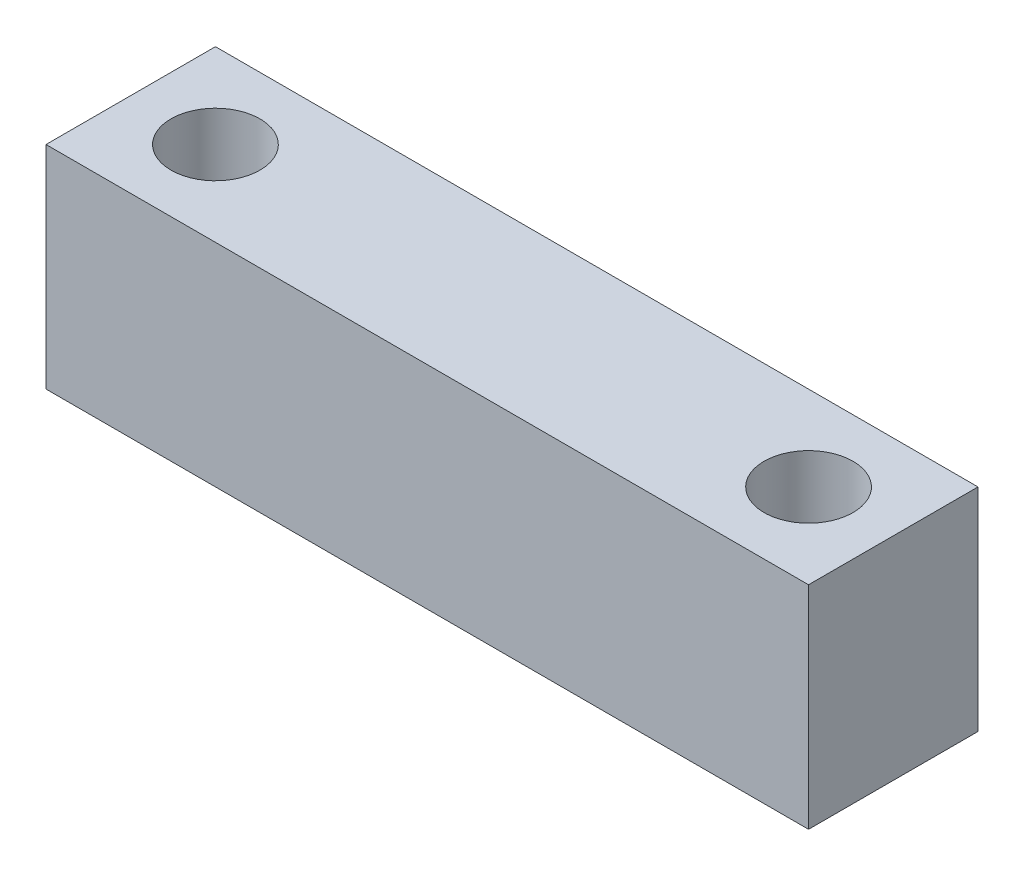
ISO-10303-21;
HEADER;
FILE_DESCRIPTION(('STEP AP214'),'2;1');
FILE_NAME('part.step','',(''),(''),'','','');
FILE_SCHEMA(('AUTOMOTIVE_DESIGN { 1 0 10303 214 1 1 1 1 }'));
ENDSEC;
DATA;
#1=APPLICATION_CONTEXT('core data for automotive mechanical design processes');
#2=APPLICATION_PROTOCOL_DEFINITION('international standard','automotive_design',2000,#1);
#3=PRODUCT_CONTEXT('',#1,'mechanical');
#4=PRODUCT('Part','Part','',(#3));
#5=PRODUCT_RELATED_PRODUCT_CATEGORY('part','',(#4));
#6=PRODUCT_DEFINITION_FORMATION('','',#4);
#7=PRODUCT_DEFINITION_CONTEXT('part definition',#1,'design');
#8=PRODUCT_DEFINITION('design','',#6,#7);
#9=PRODUCT_DEFINITION_SHAPE('','',#8);
#10=(LENGTH_UNIT() NAMED_UNIT(*) SI_UNIT(.MILLI.,.METRE.));
#11=(NAMED_UNIT(*) PLANE_ANGLE_UNIT() SI_UNIT($,.RADIAN.));
#12=(NAMED_UNIT(*) SI_UNIT($,.STERADIAN.) SOLID_ANGLE_UNIT());
#13=UNCERTAINTY_MEASURE_WITH_UNIT(LENGTH_MEASURE(1.E-05),#10,'distance_accuracy_value','');
#14=(GEOMETRIC_REPRESENTATION_CONTEXT(3) GLOBAL_UNCERTAINTY_ASSIGNED_CONTEXT((#13)) GLOBAL_UNIT_ASSIGNED_CONTEXT((#10,
#11,#12)) REPRESENTATION_CONTEXT('',''));
#15=CARTESIAN_POINT('',(0.,0.,0.));
#16=DIRECTION('',(0.,0.,1.));
#17=DIRECTION('',(1.,0.,0.));
#18=AXIS2_PLACEMENT_3D('',#15,#16,#17);
#19=CARTESIAN_POINT('',(0.,10.,0.));
#20=DIRECTION('',(0.,1.,0.));
#21=DIRECTION('',(0.,0.,1.));
#22=AXIS2_PLACEMENT_3D('',#19,#20,#21);
#23=PLANE('',#22);
#24=CARTESIAN_POINT('',(32.,10.,4.));
#25=DIRECTION('',(0.,1.,0.));
#26=DIRECTION('',(0.,0.,-1.));
#27=AXIS2_PLACEMENT_3D('',#24,#25,#26);
#28=CIRCLE('',#27,2.1);
#29=CARTESIAN_POINT('',(32.,10.,1.9));
#30=VERTEX_POINT('',#29);
#31=EDGE_CURVE('E112',#30,#30,#28,.T.);
#32=ORIENTED_EDGE('',*,*,#31,.F.);
#33=EDGE_LOOP('',(#32));
#34=FACE_BOUND('',#33,.T.);
#35=DIRECTION('',(0.,0.,1.));
#36=VECTOR('',#35,1.);
#37=CARTESIAN_POINT('',(0.,10.,0.));
#38=LINE('',#37,#36);
#39=CARTESIAN_POINT('',(0.,10.,0.));
#40=VERTEX_POINT('',#39);
#41=CARTESIAN_POINT('',(0.,10.,8.));
#42=VERTEX_POINT('',#41);
#43=EDGE_CURVE('E92',#40,#42,#38,.T.);
#44=ORIENTED_EDGE('',*,*,#43,.T.);
#45=DIRECTION('',(1.,0.,0.));
#46=VECTOR('',#45,1.);
#47=CARTESIAN_POINT('',(0.,10.,8.));
#48=LINE('',#47,#46);
#49=CARTESIAN_POINT('',(36.,10.,7.99999999999999));
#50=VERTEX_POINT('',#49);
#51=EDGE_CURVE('E87',#42,#50,#48,.T.);
#52=ORIENTED_EDGE('',*,*,#51,.T.);
#53=DIRECTION('',(0.,0.,-1.));
#54=VECTOR('',#53,1.);
#55=CARTESIAN_POINT('',(36.,10.,0.));
#56=LINE('',#55,#54);
#57=CARTESIAN_POINT('',(36.,10.,0.));
#58=VERTEX_POINT('',#57);
#59=EDGE_CURVE('E90',#50,#58,#56,.T.);
#60=ORIENTED_EDGE('',*,*,#59,.T.);
#61=DIRECTION('',(-1.,0.,0.));
#62=VECTOR('',#61,1.);
#63=CARTESIAN_POINT('',(0.,10.,0.));
#64=LINE('',#63,#62);
#65=EDGE_CURVE('E57',#58,#40,#64,.T.);
#66=ORIENTED_EDGE('',*,*,#65,.T.);
#67=EDGE_LOOP('',(#44,#52,#60,#66));
#68=FACE_BOUND('',#67,.T.);
#69=CARTESIAN_POINT('',(4.,10.,4.));
#70=DIRECTION('',(0.,1.,0.));
#71=DIRECTION('',(0.,0.,1.));
#72=AXIS2_PLACEMENT_3D('',#69,#70,#71);
#73=CIRCLE('',#72,2.1);
#74=CARTESIAN_POINT('',(4.,10.,6.1));
#75=VERTEX_POINT('',#74);
#76=EDGE_CURVE('E134',#75,#75,#73,.T.);
#77=ORIENTED_EDGE('',*,*,#76,.F.);
#78=EDGE_LOOP('',(#77));
#79=FACE_BOUND('',#78,.T.);
#80=ADVANCED_FACE('F39',(#34,#68,#79),#23,.T.);
#81=CARTESIAN_POINT('',(0.,0.,0.));
#82=DIRECTION('',(0.,1.,0.));
#83=DIRECTION('',(0.,0.,1.));
#84=AXIS2_PLACEMENT_3D('',#81,#82,#83);
#85=PLANE('',#84);
#86=DIRECTION('',(0.,0.,1.));
#87=VECTOR('',#86,1.);
#88=CARTESIAN_POINT('',(0.,0.,0.));
#89=LINE('',#88,#87);
#90=CARTESIAN_POINT('',(0.,0.,0.));
#91=VERTEX_POINT('',#90);
#92=CARTESIAN_POINT('',(0.,0.,8.));
#93=VERTEX_POINT('',#92);
#94=EDGE_CURVE('E108',#91,#93,#89,.T.);
#95=ORIENTED_EDGE('',*,*,#94,.F.);
#96=DIRECTION('',(-1.,0.,0.));
#97=VECTOR('',#96,1.);
#98=CARTESIAN_POINT('',(0.,0.,0.));
#99=LINE('',#98,#97);
#100=CARTESIAN_POINT('',(36.,0.,0.));
#101=VERTEX_POINT('',#100);
#102=EDGE_CURVE('E80',#101,#91,#99,.T.);
#103=ORIENTED_EDGE('',*,*,#102,.F.);
#104=DIRECTION('',(0.,0.,-1.));
#105=VECTOR('',#104,1.);
#106=CARTESIAN_POINT('',(36.,0.,0.));
#107=LINE('',#106,#105);
#108=CARTESIAN_POINT('',(36.,0.,7.99999999999999));
#109=VERTEX_POINT('',#108);
#110=EDGE_CURVE('E74',#109,#101,#107,.T.);
#111=ORIENTED_EDGE('',*,*,#110,.F.);
#112=DIRECTION('',(1.,0.,0.));
#113=VECTOR('',#112,1.);
#114=CARTESIAN_POINT('',(0.,0.,8.));
#115=LINE('',#114,#113);
#116=EDGE_CURVE('E97',#93,#109,#115,.T.);
#117=ORIENTED_EDGE('',*,*,#116,.F.);
#118=EDGE_LOOP('',(#95,#103,#111,#117));
#119=FACE_BOUND('',#118,.T.);
#120=CARTESIAN_POINT('',(32.,0.,4.));
#121=DIRECTION('',(0.,1.,0.));
#122=DIRECTION('',(0.,0.,-1.));
#123=AXIS2_PLACEMENT_3D('',#120,#121,#122);
#124=CIRCLE('',#123,2.1);
#125=CARTESIAN_POINT('',(32.,0.,1.9));
#126=VERTEX_POINT('',#125);
#127=EDGE_CURVE('E130',#126,#126,#124,.T.);
#128=ORIENTED_EDGE('',*,*,#127,.T.);
#129=EDGE_LOOP('',(#128));
#130=FACE_BOUND('',#129,.T.);
#131=CARTESIAN_POINT('',(4.,0.,4.));
#132=DIRECTION('',(0.,1.,0.));
#133=DIRECTION('',(0.,0.,1.));
#134=AXIS2_PLACEMENT_3D('',#131,#132,#133);
#135=CIRCLE('',#134,2.1);
#136=CARTESIAN_POINT('',(4.,0.,6.1));
#137=VERTEX_POINT('',#136);
#138=EDGE_CURVE('E138',#137,#137,#135,.T.);
#139=ORIENTED_EDGE('',*,*,#138,.T.);
#140=EDGE_LOOP('',(#139));
#141=FACE_BOUND('',#140,.T.);
#142=ADVANCED_FACE('F125',(#119,#130,#141),#85,.F.);
#143=CARTESIAN_POINT('',(0.,10.,0.));
#144=DIRECTION('',(1.,0.,0.));
#145=DIRECTION('',(0.,0.,-1.));
#146=AXIS2_PLACEMENT_3D('',#143,#144,#145);
#147=PLANE('',#146);
#148=ORIENTED_EDGE('',*,*,#94,.T.);
#149=DIRECTION('',(0.,-1.,0.));
#150=VECTOR('',#149,1.);
#151=CARTESIAN_POINT('',(0.,10.,8.));
#152=LINE('',#151,#150);
#153=EDGE_CURVE('E11',#42,#93,#152,.T.);
#154=ORIENTED_EDGE('',*,*,#153,.F.);
#155=ORIENTED_EDGE('',*,*,#43,.F.);
#156=DIRECTION('',(0.,-1.,0.));
#157=VECTOR('',#156,1.);
#158=CARTESIAN_POINT('',(0.,10.,0.));
#159=LINE('',#158,#157);
#160=EDGE_CURVE('E104',#40,#91,#159,.T.);
#161=ORIENTED_EDGE('',*,*,#160,.T.);
#162=EDGE_LOOP('',(#148,#154,#155,#161));
#163=FACE_BOUND('',#162,.T.);
#164=ADVANCED_FACE('F41',(#163),#147,.F.);
#165=CARTESIAN_POINT('',(0.,10.,8.));
#166=DIRECTION('',(0.,0.,-1.));
#167=DIRECTION('',(-1.,0.,0.));
#168=AXIS2_PLACEMENT_3D('',#165,#166,#167);
#169=PLANE('',#168);
#170=ORIENTED_EDGE('',*,*,#116,.T.);
#171=DIRECTION('',(0.,-1.,0.));
#172=VECTOR('',#171,1.);
#173=CARTESIAN_POINT('',(36.,10.,7.99999999999999));
#174=LINE('',#173,#172);
#175=EDGE_CURVE('E49',#50,#109,#174,.T.);
#176=ORIENTED_EDGE('',*,*,#175,.F.);
#177=ORIENTED_EDGE('',*,*,#51,.F.);
#178=ORIENTED_EDGE('',*,*,#153,.T.);
#179=EDGE_LOOP('',(#170,#176,#177,#178));
#180=FACE_BOUND('',#179,.T.);
#181=ADVANCED_FACE('F96',(#180),#169,.F.);
#182=CARTESIAN_POINT('',(36.,10.,0.));
#183=DIRECTION('',(-1.,0.,0.));
#184=DIRECTION('',(0.,0.,1.));
#185=AXIS2_PLACEMENT_3D('',#182,#183,#184);
#186=PLANE('',#185);
#187=ORIENTED_EDGE('',*,*,#110,.T.);
#188=DIRECTION('',(0.,-1.,0.));
#189=VECTOR('',#188,1.);
#190=CARTESIAN_POINT('',(36.,10.,0.));
#191=LINE('',#190,#189);
#192=EDGE_CURVE('E99',#58,#101,#191,.T.);
#193=ORIENTED_EDGE('',*,*,#192,.F.);
#194=ORIENTED_EDGE('',*,*,#59,.F.);
#195=ORIENTED_EDGE('',*,*,#175,.T.);
#196=EDGE_LOOP('',(#187,#193,#194,#195));
#197=FACE_BOUND('',#196,.T.);
#198=ADVANCED_FACE('F100',(#197),#186,.F.);
#199=CARTESIAN_POINT('',(0.,10.,0.));
#200=DIRECTION('',(0.,0.,1.));
#201=DIRECTION('',(1.,0.,0.));
#202=AXIS2_PLACEMENT_3D('',#199,#200,#201);
#203=PLANE('',#202);
#204=ORIENTED_EDGE('',*,*,#102,.T.);
#205=ORIENTED_EDGE('',*,*,#160,.F.);
#206=ORIENTED_EDGE('',*,*,#65,.F.);
#207=ORIENTED_EDGE('',*,*,#192,.T.);
#208=EDGE_LOOP('',(#204,#205,#206,#207));
#209=FACE_BOUND('',#208,.T.);
#210=ADVANCED_FACE('F122',(#209),#203,.F.);
#211=CARTESIAN_POINT('',(32.,10.,4.));
#212=DIRECTION('',(0.,-1.,0.));
#213=DIRECTION('',(0.,0.,-1.));
#214=AXIS2_PLACEMENT_3D('',#211,#212,#213);
#215=CYLINDRICAL_SURFACE('',#214,2.1);
#216=ORIENTED_EDGE('',*,*,#31,.T.);
#217=EDGE_LOOP('',(#216));
#218=FACE_BOUND('',#217,.T.);
#219=ORIENTED_EDGE('',*,*,#127,.F.);
#220=EDGE_LOOP('',(#219));
#221=FACE_BOUND('',#220,.T.);
#222=ADVANCED_FACE('F157',(#218,#221),#215,.F.);
#223=CARTESIAN_POINT('',(4.,10.,4.));
#224=DIRECTION('',(0.,-1.,0.));
#225=DIRECTION('',(0.,0.,-1.));
#226=AXIS2_PLACEMENT_3D('',#223,#224,#225);
#227=CYLINDRICAL_SURFACE('',#226,2.1);
#228=ORIENTED_EDGE('',*,*,#76,.T.);
#229=EDGE_LOOP('',(#228));
#230=FACE_BOUND('',#229,.T.);
#231=ORIENTED_EDGE('',*,*,#138,.F.);
#232=EDGE_LOOP('',(#231));
#233=FACE_BOUND('',#232,.T.);
#234=ADVANCED_FACE('F146',(#230,#233),#227,.F.);
#235=CLOSED_SHELL('',(#80,#142,#164,#181,#198,#210,#222,#234));
#236=MANIFOLD_SOLID_BREP('B2',#235);
#237=ADVANCED_BREP_SHAPE_REPRESENTATION('',(#18,#236),#14);
#238=SHAPE_DEFINITION_REPRESENTATION(#9,#237);
ENDSEC;
END-ISO-10303-21;
